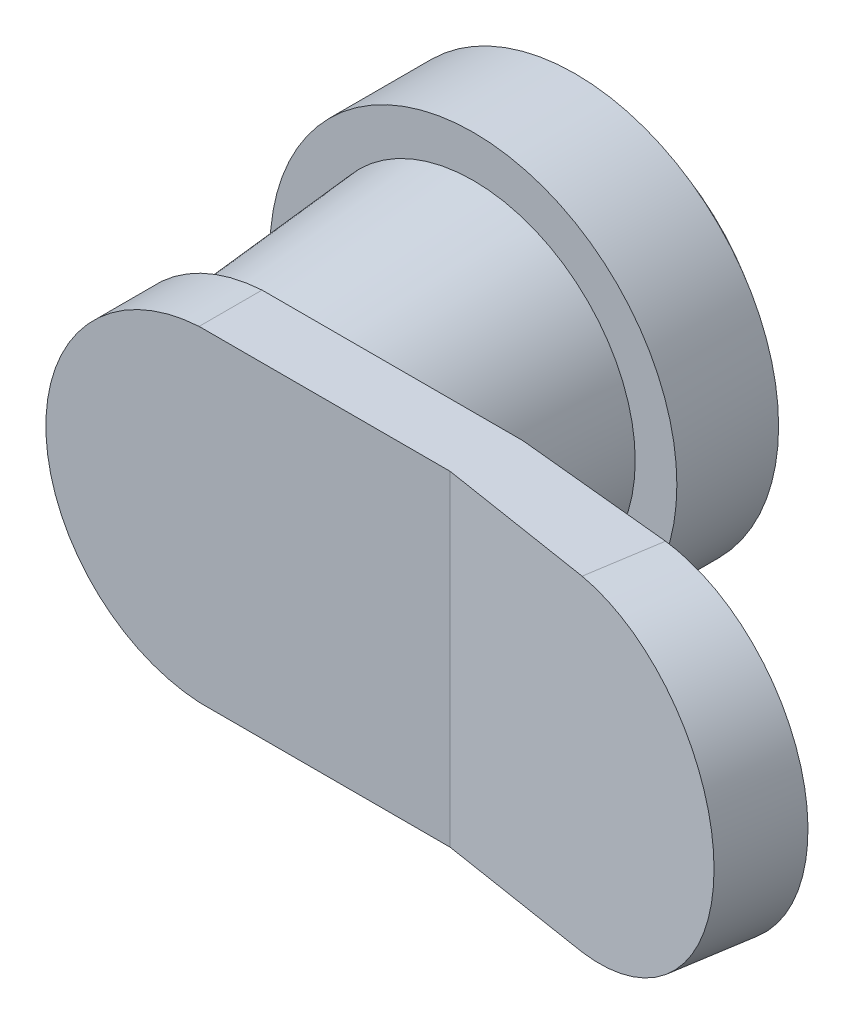
ISO-10303-21;
HEADER;
FILE_DESCRIPTION(('STEP AP214'),'2;1');
FILE_NAME('part.step','',(''),(''),'','','');
FILE_SCHEMA(('AUTOMOTIVE_DESIGN { 1 0 10303 214 1 1 1 1 }'));
ENDSEC;
DATA;
#1=APPLICATION_CONTEXT('core data for automotive mechanical design processes');
#2=APPLICATION_PROTOCOL_DEFINITION('international standard','automotive_design',2000,#1);
#3=PRODUCT_CONTEXT('',#1,'mechanical');
#4=PRODUCT('Part','Part','',(#3));
#5=PRODUCT_RELATED_PRODUCT_CATEGORY('part','',(#4));
#6=PRODUCT_DEFINITION_FORMATION('','',#4);
#7=PRODUCT_DEFINITION_CONTEXT('part definition',#1,'design');
#8=PRODUCT_DEFINITION('design','',#6,#7);
#9=PRODUCT_DEFINITION_SHAPE('','',#8);
#10=(LENGTH_UNIT() NAMED_UNIT(*) SI_UNIT(.MILLI.,.METRE.));
#11=(NAMED_UNIT(*) PLANE_ANGLE_UNIT() SI_UNIT($,.RADIAN.));
#12=(NAMED_UNIT(*) SI_UNIT($,.STERADIAN.) SOLID_ANGLE_UNIT());
#13=UNCERTAINTY_MEASURE_WITH_UNIT(LENGTH_MEASURE(1.E-05),#10,'distance_accuracy_value','');
#14=(GEOMETRIC_REPRESENTATION_CONTEXT(3) GLOBAL_UNCERTAINTY_ASSIGNED_CONTEXT((#13)) GLOBAL_UNIT_ASSIGNED_CONTEXT((#10,
#11,#12)) REPRESENTATION_CONTEXT('',''));
#15=CARTESIAN_POINT('',(0.,0.,0.));
#16=DIRECTION('',(0.,0.,1.));
#17=DIRECTION('',(1.,0.,0.));
#18=AXIS2_PLACEMENT_3D('',#15,#16,#17);
#19=CARTESIAN_POINT('',(0.,0.,0.));
#20=DIRECTION('',(0.,0.,1.));
#21=DIRECTION('',(1.,0.,0.));
#22=AXIS2_PLACEMENT_3D('',#19,#20,#21);
#23=PLANE('',#22);
#24=CARTESIAN_POINT('',(0.,0.,0.));
#25=DIRECTION('',(0.,0.,1.));
#26=DIRECTION('',(1.,0.,0.));
#27=AXIS2_PLACEMENT_3D('',#24,#25,#26);
#28=CIRCLE('',#27,10.);
#29=CARTESIAN_POINT('',(10.,0.,0.));
#30=VERTEX_POINT('',#29);
#31=EDGE_CURVE('E193',#30,#30,#28,.T.);
#32=ORIENTED_EDGE('',*,*,#31,.F.);
#33=EDGE_LOOP('',(#32));
#34=FACE_BOUND('',#33,.T.);
#35=CARTESIAN_POINT('',(0.,0.,0.));
#36=DIRECTION('',(0.,0.,1.));
#37=DIRECTION('',(1.,0.,0.));
#38=AXIS2_PLACEMENT_3D('',#35,#36,#37);
#39=CIRCLE('',#38,8.61694405287748);
#40=CARTESIAN_POINT('',(8.61694405287748,0.,0.));
#41=VERTEX_POINT('',#40);
#42=EDGE_CURVE('E11',#41,#41,#39,.F.);
#43=ORIENTED_EDGE('',*,*,#42,.F.);
#44=EDGE_LOOP('',(#43));
#45=FACE_BOUND('',#44,.T.);
#46=ADVANCED_FACE('F32',(#34,#45),#23,.F.);
#47=CARTESIAN_POINT('',(11.8573794228156,8.,18.));
#48=DIRECTION('',(0.156378990381088,0.,-0.987697125321013));
#49=DIRECTION('',(-0.987697125321013,0.,-0.156378990381088));
#50=AXIS2_PLACEMENT_3D('',#47,#48,#49);
#51=PLANE('',#50);
#52=CARTESIAN_POINT('',(19.3621260822073,0.,19.1882030184912));
#53=DIRECTION('',(0.156378990381088,0.,-0.987697125321013));
#54=DIRECTION('',(-0.987697125321013,0.,-0.156378990381088));
#55=AXIS2_PLACEMENT_3D('',#52,#53,#54);
#56=CIRCLE('',#55,8.00255397598283);
#57=CARTESIAN_POINT('',(19.5618025311637,8.,19.2198171648628));
#58=VERTEX_POINT('',#57);
#59=CARTESIAN_POINT('',(19.5618025311637,-8.,19.2198171648628));
#60=VERTEX_POINT('',#59);
#61=EDGE_CURVE('E157',#58,#60,#56,.T.);
#62=ORIENTED_EDGE('',*,*,#61,.F.);
#63=DIRECTION('',(0.987697125321013,0.,0.156378990381088));
#64=VECTOR('',#63,1.);
#65=CARTESIAN_POINT('',(11.8573794228156,8.,18.));
#66=LINE('',#65,#64);
#67=CARTESIAN_POINT('',(11.8573794228156,8.,18.));
#68=VERTEX_POINT('',#67);
#69=EDGE_CURVE('E180',#68,#58,#66,.T.);
#70=ORIENTED_EDGE('',*,*,#69,.F.);
#71=DIRECTION('',(0.,-1.,0.));
#72=VECTOR('',#71,1.);
#73=CARTESIAN_POINT('',(11.8573794228156,8.,18.));
#74=LINE('',#73,#72);
#75=CARTESIAN_POINT('',(11.8573794228156,-8.,18.));
#76=VERTEX_POINT('',#75);
#77=EDGE_CURVE('E187',#68,#76,#74,.T.);
#78=ORIENTED_EDGE('',*,*,#77,.T.);
#79=DIRECTION('',(0.987697125321013,0.,0.156378990381088));
#80=VECTOR('',#79,1.);
#81=CARTESIAN_POINT('',(11.8573794228156,-8.,18.));
#82=LINE('',#81,#80);
#83=EDGE_CURVE('E171',#76,#60,#82,.T.);
#84=ORIENTED_EDGE('',*,*,#83,.T.);
#85=EDGE_LOOP('',(#62,#70,#78,#84));
#86=FACE_BOUND('',#85,.T.);
#87=ADVANCED_FACE('F214',(#86),#51,.F.);
#88=CARTESIAN_POINT('',(27.8973120427742,8.,16.4536626540389));
#89=DIRECTION('',(-0.0989530839890505,0.,0.99509209984255));
#90=DIRECTION('',(0.99509209984255,0.,0.0989530839890505));
#91=AXIS2_PLACEMENT_3D('',#88,#89,#90);
#92=PLANE('',#91);
#93=CARTESIAN_POINT('',(19.9206632627705,0.,15.6604556767111));
#94=DIRECTION('',(-0.0989530839890505,0.,0.99509209984255));
#95=DIRECTION('',(0.99509209984255,0.,0.0989530839890505));
#96=AXIS2_PLACEMENT_3D('',#93,#94,#95);
#97=ELLIPSE('',#96,8.01599046084868,8.00255397598283);
#98=CARTESIAN_POINT('',(20.1221724785155,-8.,15.6804939810584));
#99=VERTEX_POINT('',#98);
#100=CARTESIAN_POINT('',(20.1221724785155,8.,15.6804939810584));
#101=VERTEX_POINT('',#100);
#102=EDGE_CURVE('E154',#99,#101,#97,.T.);
#103=ORIENTED_EDGE('',*,*,#102,.F.);
#104=DIRECTION('',(-0.99509209984255,0.,-0.0989530839890505));
#105=VECTOR('',#104,1.);
#106=CARTESIAN_POINT('',(27.8973120427742,-8.,16.4536626540389));
#107=LINE('',#106,#105);
#108=CARTESIAN_POINT('',(12.3470329142568,-8.,14.9073253080778));
#109=VERTEX_POINT('',#108);
#110=EDGE_CURVE('E174',#99,#109,#107,.T.);
#111=ORIENTED_EDGE('',*,*,#110,.T.);
#112=DIRECTION('',(0.,-1.,0.));
#113=VECTOR('',#112,1.);
#114=CARTESIAN_POINT('',(12.3470329142568,8.,14.9073253080778));
#115=LINE('',#114,#113);
#116=CARTESIAN_POINT('',(12.3470329142568,8.,14.9073253080778));
#117=VERTEX_POINT('',#116);
#118=EDGE_CURVE('E184',#117,#109,#115,.T.);
#119=ORIENTED_EDGE('',*,*,#118,.F.);
#120=DIRECTION('',(-0.99509209984255,0.,-0.0989530839890505));
#121=VECTOR('',#120,1.);
#122=CARTESIAN_POINT('',(27.8973120427742,8.,16.4536626540389));
#123=LINE('',#122,#121);
#124=EDGE_CURVE('E182',#101,#117,#123,.T.);
#125=ORIENTED_EDGE('',*,*,#124,.F.);
#126=EDGE_LOOP('',(#103,#111,#119,#125));
#127=FACE_BOUND('',#126,.T.);
#128=ADVANCED_FACE('F231',(#127),#92,.F.);
#129=CARTESIAN_POINT('',(-8.03855313069233,8.,14.9073253080778));
#130=DIRECTION('',(0.,1.,0.));
#131=DIRECTION('',(0.,0.,1.));
#132=AXIS2_PLACEMENT_3D('',#129,#130,#131);
#133=PLANE('',#132);
#134=ORIENTED_EDGE('',*,*,#69,.T.);
#135=DIRECTION('',(0.156378990381088,0.,-0.987697125321013));
#136=VECTOR('',#135,1.);
#137=CARTESIAN_POINT('',(10.0615403806415,8.,79.2239238098789));
#138=LINE('',#137,#136);
#139=EDGE_CURVE('E55',#58,#101,#138,.T.);
#140=ORIENTED_EDGE('',*,*,#139,.T.);
#141=ORIENTED_EDGE('',*,*,#124,.T.);
#142=DIRECTION('',(-1.,0.,0.));
#143=VECTOR('',#142,1.);
#144=CARTESIAN_POINT('',(12.3470329142568,8.,14.9073253080778));
#145=LINE('',#144,#143);
#146=CARTESIAN_POINT('',(-0.481598081819341,8.,14.9073253080778));
#147=VERTEX_POINT('',#146);
#148=EDGE_CURVE('E176',#117,#147,#145,.T.);
#149=ORIENTED_EDGE('',*,*,#148,.T.);
#150=DIRECTION('',(0.,0.,1.));
#151=VECTOR('',#150,1.);
#152=CARTESIAN_POINT('',(-0.481598081819341,8.,14.9073253080778));
#153=LINE('',#152,#151);
#154=CARTESIAN_POINT('',(-0.481598081819341,8.,18.));
#155=VERTEX_POINT('',#154);
#156=EDGE_CURVE('E165',#147,#155,#153,.T.);
#157=ORIENTED_EDGE('',*,*,#156,.T.);
#158=DIRECTION('',(1.,0.,0.));
#159=VECTOR('',#158,1.);
#160=CARTESIAN_POINT('',(-8.03855313069233,8.,18.));
#161=LINE('',#160,#159);
#162=EDGE_CURVE('E178',#155,#68,#161,.T.);
#163=ORIENTED_EDGE('',*,*,#162,.T.);
#164=EDGE_LOOP('',(#134,#140,#141,#149,#157,#163));
#165=FACE_BOUND('',#164,.T.);
#166=ADVANCED_FACE('F232',(#165),#133,.T.);
#167=CARTESIAN_POINT('',(-8.03855313069233,-8.,14.9073253080778));
#168=DIRECTION('',(0.,1.,0.));
#169=DIRECTION('',(0.,0.,1.));
#170=AXIS2_PLACEMENT_3D('',#167,#168,#169);
#171=PLANE('',#170);
#172=DIRECTION('',(0.156378990381088,0.,-0.987697125321013));
#173=VECTOR('',#172,1.);
#174=CARTESIAN_POINT('',(10.0615403806415,-8.,79.2239238098789));
#175=LINE('',#174,#173);
#176=EDGE_CURVE('E40',#60,#99,#175,.T.);
#177=ORIENTED_EDGE('',*,*,#176,.F.);
#178=ORIENTED_EDGE('',*,*,#83,.F.);
#179=DIRECTION('',(1.,0.,0.));
#180=VECTOR('',#179,1.);
#181=CARTESIAN_POINT('',(-8.03855313069233,-8.,18.));
#182=LINE('',#181,#180);
#183=CARTESIAN_POINT('',(-0.481598081819341,-8.,18.));
#184=VERTEX_POINT('',#183);
#185=EDGE_CURVE('E169',#184,#76,#182,.T.);
#186=ORIENTED_EDGE('',*,*,#185,.F.);
#187=DIRECTION('',(0.,0.,1.));
#188=VECTOR('',#187,1.);
#189=CARTESIAN_POINT('',(-0.481598081819341,-8.,14.9073253080778));
#190=LINE('',#189,#188);
#191=CARTESIAN_POINT('',(-0.481598081819341,-8.,14.9073253080778));
#192=VERTEX_POINT('',#191);
#193=EDGE_CURVE('E202',#192,#184,#190,.T.);
#194=ORIENTED_EDGE('',*,*,#193,.F.);
#195=DIRECTION('',(-1.,0.,0.));
#196=VECTOR('',#195,1.);
#197=CARTESIAN_POINT('',(12.3470329142568,-8.,14.9073253080778));
#198=LINE('',#197,#196);
#199=EDGE_CURVE('E167',#109,#192,#198,.T.);
#200=ORIENTED_EDGE('',*,*,#199,.F.);
#201=ORIENTED_EDGE('',*,*,#110,.F.);
#202=EDGE_LOOP('',(#177,#178,#186,#194,#200,#201));
#203=FACE_BOUND('',#202,.T.);
#204=ADVANCED_FACE('F211',(#203),#171,.F.);
#205=CARTESIAN_POINT('',(0.,8.,14.9073253080778));
#206=DIRECTION('',(0.,0.,1.));
#207=DIRECTION('',(1.,0.,0.));
#208=AXIS2_PLACEMENT_3D('',#205,#206,#207);
#209=PLANE('',#208);
#210=CARTESIAN_POINT('',(0.,0.,14.9073253080778));
#211=DIRECTION('',(0.,0.,1.));
#212=DIRECTION('',(1.,0.,0.));
#213=AXIS2_PLACEMENT_3D('',#210,#211,#212);
#214=CIRCLE('',#213,7.08552568906448);
#215=CARTESIAN_POINT('',(7.08552568906448,0.,14.9073253080778));
#216=VERTEX_POINT('',#215);
#217=EDGE_CURVE('E199',#216,#216,#214,.T.);
#218=ORIENTED_EDGE('',*,*,#217,.T.);
#219=EDGE_LOOP('',(#218));
#220=FACE_BOUND('',#219,.T.);
#221=CARTESIAN_POINT('',(0.,0.,14.9073253080778));
#222=DIRECTION('',(0.,0.,1.));
#223=DIRECTION('',(1.,0.,0.));
#224=AXIS2_PLACEMENT_3D('',#221,#222,#223);
#225=CIRCLE('',#224,8.0144829348132);
#226=EDGE_CURVE('E159',#147,#192,#225,.T.);
#227=ORIENTED_EDGE('',*,*,#226,.F.);
#228=ORIENTED_EDGE('',*,*,#148,.F.);
#229=ORIENTED_EDGE('',*,*,#118,.T.);
#230=ORIENTED_EDGE('',*,*,#199,.T.);
#231=EDGE_LOOP('',(#227,#228,#229,#230));
#232=FACE_BOUND('',#231,.T.);
#233=ADVANCED_FACE('F228',(#220,#232),#209,.F.);
#234=CARTESIAN_POINT('',(-8.03855313069233,8.,18.));
#235=DIRECTION('',(0.,0.,-1.));
#236=DIRECTION('',(-1.,0.,0.));
#237=AXIS2_PLACEMENT_3D('',#234,#235,#236);
#238=PLANE('',#237);
#239=CARTESIAN_POINT('',(0.,0.,18.));
#240=DIRECTION('',(0.,0.,-1.));
#241=DIRECTION('',(-1.,0.,0.));
#242=AXIS2_PLACEMENT_3D('',#239,#240,#241);
#243=CIRCLE('',#242,8.0144829348132);
#244=EDGE_CURVE('E162',#184,#155,#243,.T.);
#245=ORIENTED_EDGE('',*,*,#244,.F.);
#246=ORIENTED_EDGE('',*,*,#185,.T.);
#247=ORIENTED_EDGE('',*,*,#77,.F.);
#248=ORIENTED_EDGE('',*,*,#162,.F.);
#249=EDGE_LOOP('',(#245,#246,#247,#248));
#250=FACE_BOUND('',#249,.T.);
#251=ADVANCED_FACE('F220',(#250),#238,.F.);
#252=CARTESIAN_POINT('',(0.,0.,5.));
#253=DIRECTION('',(0.,0.,-1.));
#254=DIRECTION('',(1.,0.,0.));
#255=AXIS2_PLACEMENT_3D('',#252,#253,#254);
#256=CONICAL_SURFACE('',#255,7.95230433938477,0.0872664625997167);
#257=CARTESIAN_POINT('',(0.,0.,5.));
#258=DIRECTION('',(0.,0.,1.));
#259=DIRECTION('',(1.,0.,0.));
#260=AXIS2_PLACEMENT_3D('',#257,#258,#259);
#261=CIRCLE('',#260,7.95230433938477);
#262=CARTESIAN_POINT('',(7.95230433938477,0.,5.));
#263=VERTEX_POINT('',#262);
#264=EDGE_CURVE('E190',#263,#263,#261,.T.);
#265=ORIENTED_EDGE('',*,*,#264,.T.);
#266=EDGE_LOOP('',(#265));
#267=FACE_BOUND('',#266,.T.);
#268=ORIENTED_EDGE('',*,*,#217,.F.);
#269=EDGE_LOOP('',(#268));
#270=FACE_BOUND('',#269,.T.);
#271=ADVANCED_FACE('F251',(#267,#270),#256,.T.);
#272=CARTESIAN_POINT('',(0.,0.,5.));
#273=DIRECTION('',(0.,0.,1.));
#274=DIRECTION('',(1.,0.,0.));
#275=AXIS2_PLACEMENT_3D('',#272,#273,#274);
#276=PLANE('',#275);
#277=CARTESIAN_POINT('',(0.,0.,5.));
#278=DIRECTION('',(0.,0.,1.));
#279=DIRECTION('',(1.,0.,0.));
#280=AXIS2_PLACEMENT_3D('',#277,#278,#279);
#281=CIRCLE('',#280,10.);
#282=CARTESIAN_POINT('',(10.,0.,5.));
#283=VERTEX_POINT('',#282);
#284=EDGE_CURVE('E196',#283,#283,#281,.T.);
#285=ORIENTED_EDGE('',*,*,#284,.T.);
#286=EDGE_LOOP('',(#285));
#287=FACE_BOUND('',#286,.T.);
#288=ORIENTED_EDGE('',*,*,#264,.F.);
#289=EDGE_LOOP('',(#288));
#290=FACE_BOUND('',#289,.T.);
#291=ADVANCED_FACE('F253',(#287,#290),#276,.T.);
#292=CARTESIAN_POINT('',(0.,0.,5.));
#293=DIRECTION('',(0.,0.,-1.));
#294=DIRECTION('',(-1.,0.,0.));
#295=AXIS2_PLACEMENT_3D('',#292,#293,#294);
#296=CYLINDRICAL_SURFACE('',#295,10.);
#297=ORIENTED_EDGE('',*,*,#284,.F.);
#298=EDGE_LOOP('',(#297));
#299=FACE_BOUND('',#298,.T.);
#300=ORIENTED_EDGE('',*,*,#31,.T.);
#301=EDGE_LOOP('',(#300));
#302=FACE_BOUND('',#301,.T.);
#303=ADVANCED_FACE('F34',(#299,#302),#296,.T.);
#304=CARTESIAN_POINT('',(0.,0.,14.9073253080778));
#305=DIRECTION('',(0.,0.,1.));
#306=DIRECTION('',(1.,0.,0.));
#307=AXIS2_PLACEMENT_3D('',#304,#305,#306);
#308=CYLINDRICAL_SURFACE('',#307,8.0144829348132);
#309=ORIENTED_EDGE('',*,*,#156,.F.);
#310=ORIENTED_EDGE('',*,*,#226,.T.);
#311=ORIENTED_EDGE('',*,*,#193,.T.);
#312=ORIENTED_EDGE('',*,*,#244,.T.);
#313=EDGE_LOOP('',(#309,#310,#311,#312));
#314=FACE_BOUND('',#313,.T.);
#315=ADVANCED_FACE('F225',(#314),#308,.T.);
#316=CARTESIAN_POINT('',(9.86186393168516,0.,79.1923096635074));
#317=DIRECTION('',(0.156378990381088,0.,-0.987697125321013));
#318=DIRECTION('',(-0.987697125321013,0.,-0.156378990381088));
#319=AXIS2_PLACEMENT_3D('',#316,#317,#318);
#320=CYLINDRICAL_SURFACE('',#319,8.00255397598283);
#321=ORIENTED_EDGE('',*,*,#139,.F.);
#322=ORIENTED_EDGE('',*,*,#61,.T.);
#323=ORIENTED_EDGE('',*,*,#176,.T.);
#324=ORIENTED_EDGE('',*,*,#102,.T.);
#325=EDGE_LOOP('',(#321,#322,#323,#324));
#326=FACE_BOUND('',#325,.T.);
#327=ADVANCED_FACE('F207',(#326),#320,.T.);
#328=CARTESIAN_POINT('',(0.,0.,-1.));
#329=DIRECTION('',(0.,0.,1.));
#330=DIRECTION('',(1.,0.,0.));
#331=AXIS2_PLACEMENT_3D('',#328,#329,#330);
#332=CYLINDRICAL_SURFACE('',#331,8.61694405287748);
#333=CARTESIAN_POINT('',(0.,0.,-1.));
#334=DIRECTION('',(0.,0.,-1.));
#335=DIRECTION('',(-1.,0.,0.));
#336=AXIS2_PLACEMENT_3D('',#333,#334,#335);
#337=CIRCLE('',#336,8.61694405287748);
#338=CARTESIAN_POINT('',(-8.61694405287748,0.,-1.));
#339=VERTEX_POINT('',#338);
#340=EDGE_CURVE('E148',#339,#339,#337,.T.);
#341=ORIENTED_EDGE('',*,*,#340,.F.);
#342=EDGE_LOOP('',(#341));
#343=FACE_BOUND('',#342,.T.);
#344=ORIENTED_EDGE('',*,*,#42,.T.);
#345=EDGE_LOOP('',(#344));
#346=FACE_BOUND('',#345,.T.);
#347=ADVANCED_FACE('F325',(#343,#346),#332,.T.);
#348=CARTESIAN_POINT('',(0.,0.,-1.));
#349=DIRECTION('',(0.,0.,-1.));
#350=DIRECTION('',(-1.,0.,0.));
#351=AXIS2_PLACEMENT_3D('',#348,#349,#350);
#352=PLANE('',#351);
#353=DIRECTION('',(0.,-1.,0.));
#354=VECTOR('',#353,1.);
#355=CARTESIAN_POINT('',(2.5,0.5,-1.));
#356=LINE('',#355,#354);
#357=CARTESIAN_POINT('',(2.5,0.5,-1.));
#358=VERTEX_POINT('',#357);
#359=CARTESIAN_POINT('',(2.5,-0.5,-1.));
#360=VERTEX_POINT('',#359);
#361=EDGE_CURVE('E47',#358,#360,#356,.T.);
#362=ORIENTED_EDGE('',*,*,#361,.F.);
#363=DIRECTION('',(1.,0.,0.));
#364=VECTOR('',#363,1.);
#365=CARTESIAN_POINT('',(2.5,0.5,-1.));
#366=LINE('',#365,#364);
#367=CARTESIAN_POINT('',(-2.5,0.5,-1.));
#368=VERTEX_POINT('',#367);
#369=EDGE_CURVE('E132',#368,#358,#366,.T.);
#370=ORIENTED_EDGE('',*,*,#369,.F.);
#371=DIRECTION('',(0.,1.,0.));
#372=VECTOR('',#371,1.);
#373=CARTESIAN_POINT('',(-2.5,0.5,-1.));
#374=LINE('',#373,#372);
#375=CARTESIAN_POINT('',(-2.5,-0.5,-1.));
#376=VERTEX_POINT('',#375);
#377=EDGE_CURVE('E114',#376,#368,#374,.T.);
#378=ORIENTED_EDGE('',*,*,#377,.F.);
#379=DIRECTION('',(-1.,0.,0.));
#380=VECTOR('',#379,1.);
#381=CARTESIAN_POINT('',(2.5,-0.5,-1.));
#382=LINE('',#381,#380);
#383=EDGE_CURVE('E125',#360,#376,#382,.T.);
#384=ORIENTED_EDGE('',*,*,#383,.F.);
#385=EDGE_LOOP('',(#362,#370,#378,#384));
#386=FACE_BOUND('',#385,.T.);
#387=ORIENTED_EDGE('',*,*,#340,.T.);
#388=EDGE_LOOP('',(#387));
#389=FACE_BOUND('',#388,.T.);
#390=ADVANCED_FACE('F129',(#386,#389),#352,.T.);
#391=CARTESIAN_POINT('',(2.5,0.5,4.));
#392=DIRECTION('',(1.,0.,0.));
#393=DIRECTION('',(0.,0.,-1.));
#394=AXIS2_PLACEMENT_3D('',#391,#392,#393);
#395=PLANE('',#394);
#396=ORIENTED_EDGE('',*,*,#361,.T.);
#397=DIRECTION('',(0.,0.,-1.));
#398=VECTOR('',#397,1.);
#399=CARTESIAN_POINT('',(2.5,-0.5,4.));
#400=LINE('',#399,#398);
#401=CARTESIAN_POINT('',(2.5,-0.5,4.));
#402=VERTEX_POINT('',#401);
#403=EDGE_CURVE('E122',#402,#360,#400,.T.);
#404=ORIENTED_EDGE('',*,*,#403,.F.);
#405=DIRECTION('',(0.,-1.,0.));
#406=VECTOR('',#405,1.);
#407=CARTESIAN_POINT('',(2.5,0.5,4.));
#408=LINE('',#407,#406);
#409=CARTESIAN_POINT('',(2.5,0.5,4.));
#410=VERTEX_POINT('',#409);
#411=EDGE_CURVE('E134',#410,#402,#408,.T.);
#412=ORIENTED_EDGE('',*,*,#411,.F.);
#413=DIRECTION('',(0.,0.,-1.));
#414=VECTOR('',#413,1.);
#415=CARTESIAN_POINT('',(2.5,0.5,4.));
#416=LINE('',#415,#414);
#417=EDGE_CURVE('E146',#410,#358,#416,.T.);
#418=ORIENTED_EDGE('',*,*,#417,.T.);
#419=EDGE_LOOP('',(#396,#404,#412,#418));
#420=FACE_BOUND('',#419,.T.);
#421=ADVANCED_FACE('F345',(#420),#395,.F.);
#422=CARTESIAN_POINT('',(2.5,0.5,4.));
#423=DIRECTION('',(0.,1.,0.));
#424=DIRECTION('',(0.,0.,1.));
#425=AXIS2_PLACEMENT_3D('',#422,#423,#424);
#426=PLANE('',#425);
#427=ORIENTED_EDGE('',*,*,#369,.T.);
#428=ORIENTED_EDGE('',*,*,#417,.F.);
#429=DIRECTION('',(1.,0.,0.));
#430=VECTOR('',#429,1.);
#431=CARTESIAN_POINT('',(2.5,0.5,4.));
#432=LINE('',#431,#430);
#433=CARTESIAN_POINT('',(-2.5,0.5,4.));
#434=VERTEX_POINT('',#433);
#435=EDGE_CURVE('E143',#434,#410,#432,.T.);
#436=ORIENTED_EDGE('',*,*,#435,.F.);
#437=DIRECTION('',(0.,0.,-1.));
#438=VECTOR('',#437,1.);
#439=CARTESIAN_POINT('',(-2.5,0.5,4.));
#440=LINE('',#439,#438);
#441=EDGE_CURVE('E121',#434,#368,#440,.T.);
#442=ORIENTED_EDGE('',*,*,#441,.T.);
#443=EDGE_LOOP('',(#427,#428,#436,#442));
#444=FACE_BOUND('',#443,.T.);
#445=ADVANCED_FACE('F353',(#444),#426,.F.);
#446=CARTESIAN_POINT('',(-2.5,0.5,4.));
#447=DIRECTION('',(-1.,0.,0.));
#448=DIRECTION('',(0.,0.,1.));
#449=AXIS2_PLACEMENT_3D('',#446,#447,#448);
#450=PLANE('',#449);
#451=ORIENTED_EDGE('',*,*,#377,.T.);
#452=ORIENTED_EDGE('',*,*,#441,.F.);
#453=DIRECTION('',(0.,1.,0.));
#454=VECTOR('',#453,1.);
#455=CARTESIAN_POINT('',(-2.5,0.5,4.));
#456=LINE('',#455,#454);
#457=CARTESIAN_POINT('',(-2.5,-0.5,4.));
#458=VERTEX_POINT('',#457);
#459=EDGE_CURVE('E117',#458,#434,#456,.T.);
#460=ORIENTED_EDGE('',*,*,#459,.F.);
#461=DIRECTION('',(0.,0.,-1.));
#462=VECTOR('',#461,1.);
#463=CARTESIAN_POINT('',(-2.5,-0.5,4.));
#464=LINE('',#463,#462);
#465=EDGE_CURVE('E110',#458,#376,#464,.T.);
#466=ORIENTED_EDGE('',*,*,#465,.T.);
#467=EDGE_LOOP('',(#451,#452,#460,#466));
#468=FACE_BOUND('',#467,.T.);
#469=ADVANCED_FACE('F112',(#468),#450,.F.);
#470=CARTESIAN_POINT('',(2.5,-0.5,4.));
#471=DIRECTION('',(0.,-1.,0.));
#472=DIRECTION('',(1.,0.,0.));
#473=AXIS2_PLACEMENT_3D('',#470,#471,#472);
#474=PLANE('',#473);
#475=ORIENTED_EDGE('',*,*,#383,.T.);
#476=ORIENTED_EDGE('',*,*,#465,.F.);
#477=DIRECTION('',(-1.,0.,0.));
#478=VECTOR('',#477,1.);
#479=CARTESIAN_POINT('',(2.5,-0.5,4.));
#480=LINE('',#479,#478);
#481=EDGE_CURVE('E140',#402,#458,#480,.T.);
#482=ORIENTED_EDGE('',*,*,#481,.F.);
#483=ORIENTED_EDGE('',*,*,#403,.T.);
#484=EDGE_LOOP('',(#475,#476,#482,#483));
#485=FACE_BOUND('',#484,.T.);
#486=ADVANCED_FACE('F126',(#485),#474,.F.);
#487=CARTESIAN_POINT('',(2.5,0.5,4.));
#488=DIRECTION('',(0.,0.,-1.));
#489=DIRECTION('',(-1.,0.,0.));
#490=AXIS2_PLACEMENT_3D('',#487,#488,#489);
#491=PLANE('',#490);
#492=ORIENTED_EDGE('',*,*,#411,.T.);
#493=ORIENTED_EDGE('',*,*,#481,.T.);
#494=ORIENTED_EDGE('',*,*,#459,.T.);
#495=ORIENTED_EDGE('',*,*,#435,.T.);
#496=EDGE_LOOP('',(#492,#493,#494,#495));
#497=FACE_BOUND('',#496,.T.);
#498=ADVANCED_FACE('F376',(#497),#491,.T.);
#499=CLOSED_SHELL('',(#46,#87,#128,#166,#204,#233,#251,#271,#291,#303,#315,#327,#347,#390,#421,
#445,#469,#486,#498));
#500=MANIFOLD_SOLID_BREP('B2',#499);
#501=ADVANCED_BREP_SHAPE_REPRESENTATION('',(#18,#500),#14);
#502=SHAPE_DEFINITION_REPRESENTATION(#9,#501);
ENDSEC;
END-ISO-10303-21;
